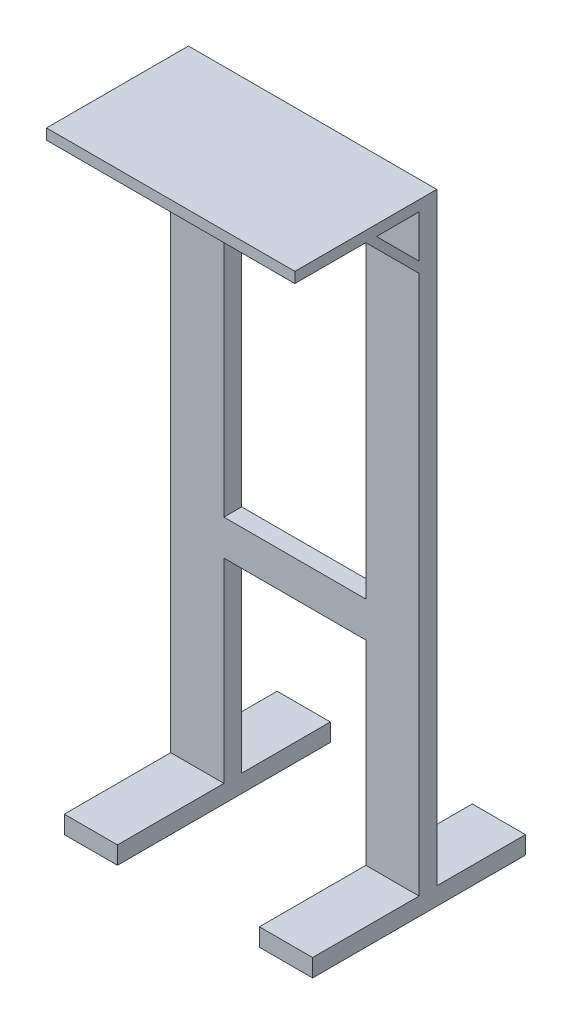
ISO-10303-21;
HEADER;
FILE_DESCRIPTION(('STEP AP214'),'2;1');
FILE_NAME('part.step','',(''),(''),'','','');
FILE_SCHEMA(('AUTOMOTIVE_DESIGN { 1 0 10303 214 1 1 1 1 }'));
ENDSEC;
DATA;
#1=APPLICATION_CONTEXT('core data for automotive mechanical design processes');
#2=APPLICATION_PROTOCOL_DEFINITION('international standard','automotive_design',2000,#1);
#3=PRODUCT_CONTEXT('',#1,'mechanical');
#4=PRODUCT('Part','Part','',(#3));
#5=PRODUCT_RELATED_PRODUCT_CATEGORY('part','',(#4));
#6=PRODUCT_DEFINITION_FORMATION('','',#4);
#7=PRODUCT_DEFINITION_CONTEXT('part definition',#1,'design');
#8=PRODUCT_DEFINITION('design','',#6,#7);
#9=PRODUCT_DEFINITION_SHAPE('','',#8);
#10=(LENGTH_UNIT() NAMED_UNIT(*) SI_UNIT(.MILLI.,.METRE.));
#11=(NAMED_UNIT(*) PLANE_ANGLE_UNIT() SI_UNIT($,.RADIAN.));
#12=(NAMED_UNIT(*) SI_UNIT($,.STERADIAN.) SOLID_ANGLE_UNIT());
#13=UNCERTAINTY_MEASURE_WITH_UNIT(LENGTH_MEASURE(1.E-05),#10,'distance_accuracy_value','');
#14=(GEOMETRIC_REPRESENTATION_CONTEXT(3) GLOBAL_UNCERTAINTY_ASSIGNED_CONTEXT((#13)) GLOBAL_UNIT_ASSIGNED_CONTEXT((#10,
#11,#12)) REPRESENTATION_CONTEXT('',''));
#15=CARTESIAN_POINT('',(0.,0.,0.));
#16=DIRECTION('',(0.,0.,1.));
#17=DIRECTION('',(1.,0.,0.));
#18=AXIS2_PLACEMENT_3D('',#15,#16,#17);
#19=CARTESIAN_POINT('',(0.,1750.,0.));
#20=DIRECTION('',(0.,0.,-1.));
#21=DIRECTION('',(-1.,0.,0.));
#22=AXIS2_PLACEMENT_3D('',#19,#20,#21);
#23=PLANE('',#22);
#24=DIRECTION('',(0.,1.,0.));
#25=VECTOR('',#24,1.);
#26=CARTESIAN_POINT('',(700.,600.,0.));
#27=LINE('',#26,#25);
#28=CARTESIAN_POINT('',(700.,50.,0.));
#29=VERTEX_POINT('',#28);
#30=CARTESIAN_POINT('',(700.,1570.,0.));
#31=VERTEX_POINT('',#30);
#32=EDGE_CURVE('E435',#29,#31,#27,.T.);
#33=ORIENTED_EDGE('',*,*,#32,.T.);
#34=DIRECTION('',(1.,0.,0.));
#35=VECTOR('',#34,1.);
#36=CARTESIAN_POINT('',(685.,1570.,0.));
#37=LINE('',#36,#35);
#38=CARTESIAN_POINT('',(685.,1570.,0.));
#39=VERTEX_POINT('',#38);
#40=EDGE_CURVE('E61',#39,#31,#37,.T.);
#41=ORIENTED_EDGE('',*,*,#40,.F.);
#42=DIRECTION('',(0.,1.,0.));
#43=VECTOR('',#42,1.);
#44=CARTESIAN_POINT('',(685.,1570.,0.));
#45=LINE('',#44,#43);
#46=CARTESIAN_POINT('',(685.,1600.,0.));
#47=VERTEX_POINT('',#46);
#48=EDGE_CURVE('E65',#39,#47,#45,.T.);
#49=ORIENTED_EDGE('',*,*,#48,.T.);
#50=DIRECTION('',(1.,0.,0.));
#51=VECTOR('',#50,1.);
#52=CARTESIAN_POINT('',(685.,1600.,0.));
#53=LINE('',#52,#51);
#54=CARTESIAN_POINT('',(700.,1600.,0.));
#55=VERTEX_POINT('',#54);
#56=EDGE_CURVE('E249',#47,#55,#53,.T.);
#57=ORIENTED_EDGE('',*,*,#56,.T.);
#58=CARTESIAN_POINT('',(700.,1720.,0.));
#59=VERTEX_POINT('',#58);
#60=EDGE_CURVE('E421',#55,#59,#27,.T.);
#61=ORIENTED_EDGE('',*,*,#60,.T.);
#62=DIRECTION('',(1.,0.,0.));
#63=VECTOR('',#62,1.);
#64=CARTESIAN_POINT('',(0.,1720.,0.));
#65=LINE('',#64,#63);
#66=CARTESIAN_POINT('',(0.,1720.,0.));
#67=VERTEX_POINT('',#66);
#68=EDGE_CURVE('E305',#67,#59,#65,.T.);
#69=ORIENTED_EDGE('',*,*,#68,.F.);
#70=DIRECTION('',(0.,-1.,0.));
#71=VECTOR('',#70,1.);
#72=CARTESIAN_POINT('',(0.,1750.,0.));
#73=LINE('',#72,#71);
#74=CARTESIAN_POINT('',(0.,1600.,0.));
#75=VERTEX_POINT('',#74);
#76=EDGE_CURVE('E467',#67,#75,#73,.T.);
#77=ORIENTED_EDGE('',*,*,#76,.T.);
#78=DIRECTION('',(-1.,0.,0.));
#79=VECTOR('',#78,1.);
#80=CARTESIAN_POINT('',(15.,1600.,0.));
#81=LINE('',#80,#79);
#82=CARTESIAN_POINT('',(15.,1600.,0.));
#83=VERTEX_POINT('',#82);
#84=EDGE_CURVE('E301',#83,#75,#81,.T.);
#85=ORIENTED_EDGE('',*,*,#84,.F.);
#86=DIRECTION('',(0.,-1.,0.));
#87=VECTOR('',#86,1.);
#88=CARTESIAN_POINT('',(15.,1570.,0.));
#89=LINE('',#88,#87);
#90=CARTESIAN_POINT('',(15.,1570.,0.));
#91=VERTEX_POINT('',#90);
#92=EDGE_CURVE('E279',#83,#91,#89,.T.);
#93=ORIENTED_EDGE('',*,*,#92,.T.);
#94=DIRECTION('',(-1.,0.,0.));
#95=VECTOR('',#94,1.);
#96=CARTESIAN_POINT('',(15.,1570.,0.));
#97=LINE('',#96,#95);
#98=CARTESIAN_POINT('',(0.,1570.,0.));
#99=VERTEX_POINT('',#98);
#100=EDGE_CURVE('E294',#91,#99,#97,.T.);
#101=ORIENTED_EDGE('',*,*,#100,.T.);
#102=CARTESIAN_POINT('',(0.,50.,0.));
#103=VERTEX_POINT('',#102);
#104=EDGE_CURVE('E460',#99,#103,#73,.T.);
#105=ORIENTED_EDGE('',*,*,#104,.T.);
#106=DIRECTION('',(1.,0.,0.));
#107=VECTOR('',#106,1.);
#108=CARTESIAN_POINT('',(0.,50.,0.));
#109=LINE('',#108,#107);
#110=CARTESIAN_POINT('',(150.,50.,0.));
#111=VERTEX_POINT('',#110);
#112=EDGE_CURVE('E452',#103,#111,#109,.T.);
#113=ORIENTED_EDGE('',*,*,#112,.T.);
#114=DIRECTION('',(0.,-1.,0.));
#115=VECTOR('',#114,1.);
#116=CARTESIAN_POINT('',(150.,1750.,0.));
#117=LINE('',#116,#115);
#118=CARTESIAN_POINT('',(150.,600.,0.));
#119=VERTEX_POINT('',#118);
#120=EDGE_CURVE('E477',#119,#111,#117,.T.);
#121=ORIENTED_EDGE('',*,*,#120,.F.);
#122=DIRECTION('',(1.,0.,0.));
#123=VECTOR('',#122,1.);
#124=CARTESIAN_POINT('',(700.,600.,0.));
#125=LINE('',#124,#123);
#126=CARTESIAN_POINT('',(550.,600.,0.));
#127=VERTEX_POINT('',#126);
#128=EDGE_CURVE('E427',#119,#127,#125,.T.);
#129=ORIENTED_EDGE('',*,*,#128,.T.);
#130=DIRECTION('',(0.,-1.,0.));
#131=VECTOR('',#130,1.);
#132=CARTESIAN_POINT('',(550.,1750.,0.));
#133=LINE('',#132,#131);
#134=CARTESIAN_POINT('',(550.,50.,0.));
#135=VERTEX_POINT('',#134);
#136=EDGE_CURVE('E357',#127,#135,#133,.T.);
#137=ORIENTED_EDGE('',*,*,#136,.T.);
#138=DIRECTION('',(-1.,0.,0.));
#139=VECTOR('',#138,1.);
#140=CARTESIAN_POINT('',(700.,50.,0.));
#141=LINE('',#140,#139);
#142=EDGE_CURVE('E365',#29,#135,#141,.T.);
#143=ORIENTED_EDGE('',*,*,#142,.F.);
#144=EDGE_LOOP('',(#33,#41,#49,#57,#61,#69,#77,#85,#93,#101,#105,#113,#121,#129,#137,#143));
#145=FACE_BOUND('',#144,.T.);
#146=CARTESIAN_POINT('',(150.,1650.,0.));
#147=VERTEX_POINT('',#146);
#148=CARTESIAN_POINT('',(150.,700.,0.));
#149=VERTEX_POINT('',#148);
#150=EDGE_CURVE('E478',#147,#149,#117,.T.);
#151=ORIENTED_EDGE('',*,*,#150,.F.);
#152=DIRECTION('',(1.,0.,0.));
#153=VECTOR('',#152,1.);
#154=CARTESIAN_POINT('',(0.,1650.,0.));
#155=LINE('',#154,#153);
#156=CARTESIAN_POINT('',(550.,1650.,0.));
#157=VERTEX_POINT('',#156);
#158=EDGE_CURVE('E343',#147,#157,#155,.T.);
#159=ORIENTED_EDGE('',*,*,#158,.T.);
#160=CARTESIAN_POINT('',(550.,700.,0.));
#161=VERTEX_POINT('',#160);
#162=EDGE_CURVE('E353',#157,#161,#133,.T.);
#163=ORIENTED_EDGE('',*,*,#162,.T.);
#164=DIRECTION('',(-1.,0.,0.));
#165=VECTOR('',#164,1.);
#166=CARTESIAN_POINT('',(700.,700.,0.));
#167=LINE('',#166,#165);
#168=EDGE_CURVE('E438',#161,#149,#167,.T.);
#169=ORIENTED_EDGE('',*,*,#168,.T.);
#170=EDGE_LOOP('',(#151,#159,#163,#169));
#171=FACE_BOUND('',#170,.T.);
#172=ADVANCED_FACE('F45',(#145,#171),#23,.F.);
#173=CARTESIAN_POINT('',(150.,50.,-300.));
#174=DIRECTION('',(-1.,0.,0.));
#175=DIRECTION('',(0.,0.,1.));
#176=AXIS2_PLACEMENT_3D('',#173,#174,#175);
#177=PLANE('',#176);
#178=DIRECTION('',(0.,-1.,0.));
#179=VECTOR('',#178,1.);
#180=CARTESIAN_POINT('',(150.,1750.,-50.));
#181=LINE('',#180,#179);
#182=CARTESIAN_POINT('',(150.,600.,-50.));
#183=VERTEX_POINT('',#182);
#184=CARTESIAN_POINT('',(150.,50.,-50.));
#185=VERTEX_POINT('',#184);
#186=EDGE_CURVE('E473',#183,#185,#181,.T.);
#187=ORIENTED_EDGE('',*,*,#186,.F.);
#188=DIRECTION('',(0.,0.,1.));
#189=VECTOR('',#188,1.);
#190=CARTESIAN_POINT('',(150.,600.,-300.));
#191=LINE('',#190,#189);
#192=EDGE_CURVE('E448',#183,#119,#191,.T.);
#193=ORIENTED_EDGE('',*,*,#192,.T.);
#194=ORIENTED_EDGE('',*,*,#120,.T.);
#195=DIRECTION('',(0.,0.,1.));
#196=VECTOR('',#195,1.);
#197=CARTESIAN_POINT('',(150.,50.,-300.));
#198=LINE('',#197,#196);
#199=CARTESIAN_POINT('',(150.,50.,300.));
#200=VERTEX_POINT('',#199);
#201=EDGE_CURVE('E524',#111,#200,#198,.T.);
#202=ORIENTED_EDGE('',*,*,#201,.T.);
#203=DIRECTION('',(0.,-1.,0.));
#204=VECTOR('',#203,1.);
#205=CARTESIAN_POINT('',(150.,50.,300.));
#206=LINE('',#205,#204);
#207=CARTESIAN_POINT('',(150.,0.,300.));
#208=VERTEX_POINT('',#207);
#209=EDGE_CURVE('E485',#200,#208,#206,.T.);
#210=ORIENTED_EDGE('',*,*,#209,.T.);
#211=DIRECTION('',(0.,0.,1.));
#212=VECTOR('',#211,1.);
#213=CARTESIAN_POINT('',(150.,0.,-300.));
#214=LINE('',#213,#212);
#215=CARTESIAN_POINT('',(150.,0.,-300.));
#216=VERTEX_POINT('',#215);
#217=EDGE_CURVE('E511',#216,#208,#214,.T.);
#218=ORIENTED_EDGE('',*,*,#217,.F.);
#219=DIRECTION('',(0.,-1.,0.));
#220=VECTOR('',#219,1.);
#221=CARTESIAN_POINT('',(150.,50.,-300.));
#222=LINE('',#221,#220);
#223=CARTESIAN_POINT('',(150.,50.,-300.));
#224=VERTEX_POINT('',#223);
#225=EDGE_CURVE('E501',#224,#216,#222,.T.);
#226=ORIENTED_EDGE('',*,*,#225,.F.);
#227=EDGE_CURVE('E520',#224,#185,#198,.T.);
#228=ORIENTED_EDGE('',*,*,#227,.T.);
#229=EDGE_LOOP('',(#187,#193,#194,#202,#210,#218,#226,#228));
#230=FACE_BOUND('',#229,.T.);
#231=ADVANCED_FACE('F553',(#230),#177,.F.);
#232=CARTESIAN_POINT('',(0.,50.,-300.));
#233=DIRECTION('',(0.,-1.,0.));
#234=DIRECTION('',(0.,0.,-1.));
#235=AXIS2_PLACEMENT_3D('',#232,#233,#234);
#236=PLANE('',#235);
#237=ORIENTED_EDGE('',*,*,#112,.F.);
#238=DIRECTION('',(0.,0.,1.));
#239=VECTOR('',#238,1.);
#240=CARTESIAN_POINT('',(0.,50.,-300.));
#241=LINE('',#240,#239);
#242=CARTESIAN_POINT('',(0.,50.,300.));
#243=VERTEX_POINT('',#242);
#244=EDGE_CURVE('E519',#103,#243,#241,.T.);
#245=ORIENTED_EDGE('',*,*,#244,.T.);
#246=DIRECTION('',(1.,0.,0.));
#247=VECTOR('',#246,1.);
#248=CARTESIAN_POINT('',(0.,50.,300.));
#249=LINE('',#248,#247);
#250=EDGE_CURVE('E489',#243,#200,#249,.T.);
#251=ORIENTED_EDGE('',*,*,#250,.T.);
#252=ORIENTED_EDGE('',*,*,#201,.F.);
#253=EDGE_LOOP('',(#237,#245,#251,#252));
#254=FACE_BOUND('',#253,.T.);
#255=ADVANCED_FACE('F566',(#254),#236,.F.);
#256=CARTESIAN_POINT('',(0.,0.,-300.));
#257=DIRECTION('',(0.,-1.,0.));
#258=DIRECTION('',(0.,0.,-1.));
#259=AXIS2_PLACEMENT_3D('',#256,#257,#258);
#260=PLANE('',#259);
#261=ORIENTED_EDGE('',*,*,#217,.T.);
#262=DIRECTION('',(1.,0.,0.));
#263=VECTOR('',#262,1.);
#264=CARTESIAN_POINT('',(0.,0.,300.));
#265=LINE('',#264,#263);
#266=CARTESIAN_POINT('',(0.,0.,300.));
#267=VERTEX_POINT('',#266);
#268=EDGE_CURVE('E481',#267,#208,#265,.T.);
#269=ORIENTED_EDGE('',*,*,#268,.F.);
#270=DIRECTION('',(0.,0.,1.));
#271=VECTOR('',#270,1.);
#272=CARTESIAN_POINT('',(0.,0.,-300.));
#273=LINE('',#272,#271);
#274=CARTESIAN_POINT('',(0.,0.,-300.));
#275=VERTEX_POINT('',#274);
#276=EDGE_CURVE('E512',#275,#267,#273,.T.);
#277=ORIENTED_EDGE('',*,*,#276,.F.);
#278=DIRECTION('',(1.,0.,0.));
#279=VECTOR('',#278,1.);
#280=CARTESIAN_POINT('',(0.,0.,-300.));
#281=LINE('',#280,#279);
#282=EDGE_CURVE('E497',#275,#216,#281,.T.);
#283=ORIENTED_EDGE('',*,*,#282,.T.);
#284=EDGE_LOOP('',(#261,#269,#277,#283));
#285=FACE_BOUND('',#284,.T.);
#286=ADVANCED_FACE('F47',(#285),#260,.T.);
#287=CARTESIAN_POINT('',(0.,50.,-300.));
#288=DIRECTION('',(-1.,0.,0.));
#289=DIRECTION('',(0.,0.,1.));
#290=AXIS2_PLACEMENT_3D('',#287,#288,#289);
#291=PLANE('',#290);
#292=ORIENTED_EDGE('',*,*,#104,.F.);
#293=DIRECTION('',(0.,0.707106781186547,0.707106781186548));
#294=VECTOR('',#293,1.);
#295=CARTESIAN_POINT('',(0.,1570.,0.));
#296=LINE('',#295,#294);
#297=CARTESIAN_POINT('',(0.,1720.,150.));
#298=VERTEX_POINT('',#297);
#299=EDGE_CURVE('E272',#99,#298,#296,.T.);
#300=ORIENTED_EDGE('',*,*,#299,.T.);
#301=DIRECTION('',(0.,0.,-1.));
#302=VECTOR('',#301,1.);
#303=CARTESIAN_POINT('',(0.,1720.,350.));
#304=LINE('',#303,#302);
#305=CARTESIAN_POINT('',(0.,1720.,350.));
#306=VERTEX_POINT('',#305);
#307=EDGE_CURVE('E339',#306,#298,#304,.T.);
#308=ORIENTED_EDGE('',*,*,#307,.F.);
#309=DIRECTION('',(0.,-1.,0.));
#310=VECTOR('',#309,1.);
#311=CARTESIAN_POINT('',(0.,1750.,350.));
#312=LINE('',#311,#310);
#313=CARTESIAN_POINT('',(0.,1750.,350.));
#314=VERTEX_POINT('',#313);
#315=EDGE_CURVE('E317',#314,#306,#312,.T.);
#316=ORIENTED_EDGE('',*,*,#315,.F.);
#317=DIRECTION('',(0.,0.,1.));
#318=VECTOR('',#317,1.);
#319=CARTESIAN_POINT('',(0.,1750.,-50.));
#320=LINE('',#319,#318);
#321=CARTESIAN_POINT('',(0.,1750.,-50.));
#322=VERTEX_POINT('',#321);
#323=EDGE_CURVE('E456',#322,#314,#320,.T.);
#324=ORIENTED_EDGE('',*,*,#323,.F.);
#325=DIRECTION('',(0.,-1.,0.));
#326=VECTOR('',#325,1.);
#327=CARTESIAN_POINT('',(0.,1750.,-50.));
#328=LINE('',#327,#326);
#329=CARTESIAN_POINT('',(0.,50.,-50.));
#330=VERTEX_POINT('',#329);
#331=EDGE_CURVE('E470',#322,#330,#328,.T.);
#332=ORIENTED_EDGE('',*,*,#331,.T.);
#333=CARTESIAN_POINT('',(0.,50.,-300.));
#334=VERTEX_POINT('',#333);
#335=EDGE_CURVE('E515',#334,#330,#241,.T.);
#336=ORIENTED_EDGE('',*,*,#335,.F.);
#337=DIRECTION('',(0.,-1.,0.));
#338=VECTOR('',#337,1.);
#339=CARTESIAN_POINT('',(0.,50.,-300.));
#340=LINE('',#339,#338);
#341=EDGE_CURVE('E507',#334,#275,#340,.T.);
#342=ORIENTED_EDGE('',*,*,#341,.T.);
#343=ORIENTED_EDGE('',*,*,#276,.T.);
#344=DIRECTION('',(0.,-1.,0.));
#345=VECTOR('',#344,1.);
#346=CARTESIAN_POINT('',(0.,50.,300.));
#347=LINE('',#346,#345);
#348=EDGE_CURVE('E493',#243,#267,#347,.T.);
#349=ORIENTED_EDGE('',*,*,#348,.F.);
#350=ORIENTED_EDGE('',*,*,#244,.F.);
#351=EDGE_LOOP('',(#292,#300,#308,#316,#324,#332,#336,#342,#343,#349,#350));
#352=FACE_BOUND('',#351,.T.);
#353=DIRECTION('',(0.,-0.707106781186547,-0.707106781186548));
#354=VECTOR('',#353,1.);
#355=CARTESIAN_POINT('',(0.,1600.,0.));
#356=LINE('',#355,#354);
#357=CARTESIAN_POINT('',(0.,1720.,120.));
#358=VERTEX_POINT('',#357);
#359=EDGE_CURVE('E283',#358,#75,#356,.T.);
#360=ORIENTED_EDGE('',*,*,#359,.T.);
#361=ORIENTED_EDGE('',*,*,#76,.F.);
#362=EDGE_CURVE('E338',#358,#67,#304,.T.);
#363=ORIENTED_EDGE('',*,*,#362,.F.);
#364=EDGE_LOOP('',(#360,#361,#363));
#365=FACE_BOUND('',#364,.T.);
#366=ADVANCED_FACE('F563',(#352,#365),#291,.T.);
#367=ORIENTED_EDGE('',*,*,#335,.T.);
#368=DIRECTION('',(1.,0.,0.));
#369=VECTOR('',#368,1.);
#370=CARTESIAN_POINT('',(0.,50.,-50.));
#371=LINE('',#370,#369);
#372=EDGE_CURVE('E457',#330,#185,#371,.T.);
#373=ORIENTED_EDGE('',*,*,#372,.T.);
#374=ORIENTED_EDGE('',*,*,#227,.F.);
#375=DIRECTION('',(1.,0.,0.));
#376=VECTOR('',#375,1.);
#377=CARTESIAN_POINT('',(0.,50.,-300.));
#378=LINE('',#377,#376);
#379=EDGE_CURVE('E504',#334,#224,#378,.T.);
#380=ORIENTED_EDGE('',*,*,#379,.F.);
#381=EDGE_LOOP('',(#367,#373,#374,#380));
#382=FACE_BOUND('',#381,.T.);
#383=ADVANCED_FACE('F552',(#382),#236,.F.);
#384=CARTESIAN_POINT('',(150.,1650.,-50.));
#385=VERTEX_POINT('',#384);
#386=CARTESIAN_POINT('',(150.,700.,-50.));
#387=VERTEX_POINT('',#386);
#388=EDGE_CURVE('E474',#385,#387,#181,.T.);
#389=ORIENTED_EDGE('',*,*,#388,.F.);
#390=DIRECTION('',(0.,0.,1.));
#391=VECTOR('',#390,1.);
#392=CARTESIAN_POINT('',(150.,1650.,-300.));
#393=LINE('',#392,#391);
#394=EDGE_CURVE('E346',#385,#147,#393,.T.);
#395=ORIENTED_EDGE('',*,*,#394,.T.);
#396=ORIENTED_EDGE('',*,*,#150,.T.);
#397=DIRECTION('',(0.,0.,-1.));
#398=VECTOR('',#397,1.);
#399=CARTESIAN_POINT('',(150.,700.,-300.));
#400=LINE('',#399,#398);
#401=EDGE_CURVE('E434',#149,#387,#400,.T.);
#402=ORIENTED_EDGE('',*,*,#401,.T.);
#403=EDGE_LOOP('',(#389,#395,#396,#402));
#404=FACE_BOUND('',#403,.T.);
#405=ADVANCED_FACE('F549',(#404),#177,.F.);
#406=CARTESIAN_POINT('',(0.,0.,-300.));
#407=DIRECTION('',(0.,0.,-1.));
#408=DIRECTION('',(-1.,0.,0.));
#409=AXIS2_PLACEMENT_3D('',#406,#407,#408);
#410=PLANE('',#409);
#411=ORIENTED_EDGE('',*,*,#282,.F.);
#412=ORIENTED_EDGE('',*,*,#341,.F.);
#413=ORIENTED_EDGE('',*,*,#379,.T.);
#414=ORIENTED_EDGE('',*,*,#225,.T.);
#415=EDGE_LOOP('',(#411,#412,#413,#414));
#416=FACE_BOUND('',#415,.T.);
#417=ADVANCED_FACE('F551',(#416),#410,.T.);
#418=CARTESIAN_POINT('',(0.,0.,300.));
#419=DIRECTION('',(0.,0.,-1.));
#420=DIRECTION('',(-1.,0.,0.));
#421=AXIS2_PLACEMENT_3D('',#418,#419,#420);
#422=PLANE('',#421);
#423=ORIENTED_EDGE('',*,*,#268,.T.);
#424=ORIENTED_EDGE('',*,*,#209,.F.);
#425=ORIENTED_EDGE('',*,*,#250,.F.);
#426=ORIENTED_EDGE('',*,*,#348,.T.);
#427=EDGE_LOOP('',(#423,#424,#425,#426));
#428=FACE_BOUND('',#427,.T.);
#429=ADVANCED_FACE('F559',(#428),#422,.F.);
#430=CARTESIAN_POINT('',(0.,1750.,-50.));
#431=DIRECTION('',(0.,0.,-1.));
#432=DIRECTION('',(-1.,0.,0.));
#433=AXIS2_PLACEMENT_3D('',#430,#431,#432);
#434=PLANE('',#433);
#435=DIRECTION('',(1.,0.,0.));
#436=VECTOR('',#435,1.);
#437=CARTESIAN_POINT('',(0.,1650.,-49.9999999999998));
#438=LINE('',#437,#436);
#439=CARTESIAN_POINT('',(550.,1650.,-49.9999999999998));
#440=VERTEX_POINT('',#439);
#441=EDGE_CURVE('E342',#385,#440,#438,.T.);
#442=ORIENTED_EDGE('',*,*,#441,.F.);
#443=ORIENTED_EDGE('',*,*,#388,.T.);
#444=DIRECTION('',(-1.,0.,0.));
#445=VECTOR('',#444,1.);
#446=CARTESIAN_POINT('',(700.,700.,-49.9999999999998));
#447=LINE('',#446,#445);
#448=CARTESIAN_POINT('',(550.,700.,-50.));
#449=VERTEX_POINT('',#448);
#450=EDGE_CURVE('E426',#449,#387,#447,.T.);
#451=ORIENTED_EDGE('',*,*,#450,.F.);
#452=DIRECTION('',(0.,-1.,0.));
#453=VECTOR('',#452,1.);
#454=CARTESIAN_POINT('',(550.,1750.,-50.));
#455=LINE('',#454,#453);
#456=EDGE_CURVE('E358',#440,#449,#455,.T.);
#457=ORIENTED_EDGE('',*,*,#456,.F.);
#458=EDGE_LOOP('',(#442,#443,#451,#457));
#459=FACE_BOUND('',#458,.T.);
#460=DIRECTION('',(1.,0.,0.));
#461=VECTOR('',#460,1.);
#462=CARTESIAN_POINT('',(0.,1750.,-50.));
#463=LINE('',#462,#461);
#464=CARTESIAN_POINT('',(700.,1750.,-50.));
#465=VERTEX_POINT('',#464);
#466=EDGE_CURVE('E453',#322,#465,#463,.T.);
#467=ORIENTED_EDGE('',*,*,#466,.T.);
#468=DIRECTION('',(0.,1.,0.));
#469=VECTOR('',#468,1.);
#470=CARTESIAN_POINT('',(700.,600.,-49.9999999999998));
#471=LINE('',#470,#469);
#472=CARTESIAN_POINT('',(700.,50.,-50.));
#473=VERTEX_POINT('',#472);
#474=EDGE_CURVE('E422',#473,#465,#471,.T.);
#475=ORIENTED_EDGE('',*,*,#474,.F.);
#476=DIRECTION('',(-1.,0.,0.));
#477=VECTOR('',#476,1.);
#478=CARTESIAN_POINT('',(700.,50.,-50.));
#479=LINE('',#478,#477);
#480=CARTESIAN_POINT('',(550.,50.,-50.));
#481=VERTEX_POINT('',#480);
#482=EDGE_CURVE('E361',#473,#481,#479,.T.);
#483=ORIENTED_EDGE('',*,*,#482,.T.);
#484=CARTESIAN_POINT('',(550.,600.,-49.9999999999998));
#485=VERTEX_POINT('',#484);
#486=EDGE_CURVE('E352',#485,#481,#455,.T.);
#487=ORIENTED_EDGE('',*,*,#486,.F.);
#488=DIRECTION('',(1.,0.,0.));
#489=VECTOR('',#488,1.);
#490=CARTESIAN_POINT('',(700.,600.,-49.9999999999998));
#491=LINE('',#490,#489);
#492=EDGE_CURVE('E431',#183,#485,#491,.T.);
#493=ORIENTED_EDGE('',*,*,#492,.F.);
#494=ORIENTED_EDGE('',*,*,#186,.T.);
#495=ORIENTED_EDGE('',*,*,#372,.F.);
#496=ORIENTED_EDGE('',*,*,#331,.F.);
#497=EDGE_LOOP('',(#467,#475,#483,#487,#493,#494,#495,#496));
#498=FACE_BOUND('',#497,.T.);
#499=ADVANCED_FACE('F546',(#459,#498),#434,.T.);
#500=CARTESIAN_POINT('',(0.,1750.,0.));
#501=DIRECTION('',(0.,-1.,0.));
#502=DIRECTION('',(0.,0.,-1.));
#503=AXIS2_PLACEMENT_3D('',#500,#501,#502);
#504=PLANE('',#503);
#505=ORIENTED_EDGE('',*,*,#323,.T.);
#506=DIRECTION('',(-1.,0.,0.));
#507=VECTOR('',#506,1.);
#508=CARTESIAN_POINT('',(0.,1750.,350.));
#509=LINE('',#508,#507);
#510=CARTESIAN_POINT('',(700.,1750.,350.));
#511=VERTEX_POINT('',#510);
#512=EDGE_CURVE('E328',#511,#314,#509,.T.);
#513=ORIENTED_EDGE('',*,*,#512,.F.);
#514=DIRECTION('',(0.,0.,1.));
#515=VECTOR('',#514,1.);
#516=CARTESIAN_POINT('',(700.,1750.,-50.));
#517=LINE('',#516,#515);
#518=EDGE_CURVE('E356',#465,#511,#517,.T.);
#519=ORIENTED_EDGE('',*,*,#518,.F.);
#520=ORIENTED_EDGE('',*,*,#466,.F.);
#521=EDGE_LOOP('',(#505,#513,#519,#520));
#522=FACE_BOUND('',#521,.T.);
#523=ADVANCED_FACE('F647',(#522),#504,.F.);
#524=CARTESIAN_POINT('',(700.,600.,-49.9999999999998));
#525=DIRECTION('',(0.,-1.,0.));
#526=DIRECTION('',(0.,0.,-1.));
#527=AXIS2_PLACEMENT_3D('',#524,#525,#526);
#528=PLANE('',#527);
#529=DIRECTION('',(0.,0.,-1.));
#530=VECTOR('',#529,1.);
#531=CARTESIAN_POINT('',(550.,600.,-49.9999999999998));
#532=LINE('',#531,#530);
#533=EDGE_CURVE('E417',#127,#485,#532,.T.);
#534=ORIENTED_EDGE('',*,*,#533,.F.);
#535=ORIENTED_EDGE('',*,*,#128,.F.);
#536=ORIENTED_EDGE('',*,*,#192,.F.);
#537=ORIENTED_EDGE('',*,*,#492,.T.);
#538=EDGE_LOOP('',(#534,#535,#536,#537));
#539=FACE_BOUND('',#538,.T.);
#540=ADVANCED_FACE('F691',(#539),#528,.T.);
#541=CARTESIAN_POINT('',(700.,700.,-49.9999999999998));
#542=DIRECTION('',(0.,1.,0.));
#543=DIRECTION('',(-1.,0.,0.));
#544=AXIS2_PLACEMENT_3D('',#541,#542,#543);
#545=PLANE('',#544);
#546=DIRECTION('',(0.,0.,1.));
#547=VECTOR('',#546,1.);
#548=CARTESIAN_POINT('',(550.,700.,-49.9999999999998));
#549=LINE('',#548,#547);
#550=EDGE_CURVE('E54',#449,#161,#549,.T.);
#551=ORIENTED_EDGE('',*,*,#550,.F.);
#552=ORIENTED_EDGE('',*,*,#450,.T.);
#553=ORIENTED_EDGE('',*,*,#401,.F.);
#554=ORIENTED_EDGE('',*,*,#168,.F.);
#555=EDGE_LOOP('',(#551,#552,#553,#554));
#556=FACE_BOUND('',#555,.T.);
#557=ADVANCED_FACE('F537',(#556),#545,.T.);
#558=CARTESIAN_POINT('',(700.,600.,-49.9999999999998));
#559=DIRECTION('',(1.,0.,0.));
#560=DIRECTION('',(0.,0.,-1.));
#561=AXIS2_PLACEMENT_3D('',#558,#559,#560);
#562=PLANE('',#561);
#563=ORIENTED_EDGE('',*,*,#60,.F.);
#564=DIRECTION('',(0.,0.707106781186547,0.707106781186548));
#565=VECTOR('',#564,1.);
#566=CARTESIAN_POINT('',(700.,1600.,0.));
#567=LINE('',#566,#565);
#568=CARTESIAN_POINT('',(700.,1720.,120.));
#569=VERTEX_POINT('',#568);
#570=EDGE_CURVE('E626',#55,#569,#567,.T.);
#571=ORIENTED_EDGE('',*,*,#570,.T.);
#572=DIRECTION('',(0.,0.,-1.));
#573=VECTOR('',#572,1.);
#574=CARTESIAN_POINT('',(700.,1720.,350.));
#575=LINE('',#574,#573);
#576=EDGE_CURVE('E266',#569,#59,#575,.T.);
#577=ORIENTED_EDGE('',*,*,#576,.T.);
#578=EDGE_LOOP('',(#563,#571,#577));
#579=FACE_BOUND('',#578,.T.);
#580=ORIENTED_EDGE('',*,*,#474,.T.);
#581=ORIENTED_EDGE('',*,*,#518,.T.);
#582=DIRECTION('',(0.,1.,0.));
#583=VECTOR('',#582,1.);
#584=CARTESIAN_POINT('',(700.,1750.,350.));
#585=LINE('',#584,#583);
#586=CARTESIAN_POINT('',(700.,1720.,350.));
#587=VERTEX_POINT('',#586);
#588=EDGE_CURVE('E324',#587,#511,#585,.T.);
#589=ORIENTED_EDGE('',*,*,#588,.F.);
#590=CARTESIAN_POINT('',(700.,1720.,150.));
#591=VERTEX_POINT('',#590);
#592=EDGE_CURVE('E334',#587,#591,#575,.T.);
#593=ORIENTED_EDGE('',*,*,#592,.T.);
#594=DIRECTION('',(0.,-0.707106781186547,-0.707106781186548));
#595=VECTOR('',#594,1.);
#596=CARTESIAN_POINT('',(700.,1720.,150.));
#597=LINE('',#596,#595);
#598=EDGE_CURVE('E628',#591,#31,#597,.T.);
#599=ORIENTED_EDGE('',*,*,#598,.T.);
#600=ORIENTED_EDGE('',*,*,#32,.F.);
#601=DIRECTION('',(0.,0.,1.));
#602=VECTOR('',#601,1.);
#603=CARTESIAN_POINT('',(700.,50.,-300.));
#604=LINE('',#603,#602);
#605=CARTESIAN_POINT('',(700.,50.,300.));
#606=VERTEX_POINT('',#605);
#607=EDGE_CURVE('E379',#29,#606,#604,.T.);
#608=ORIENTED_EDGE('',*,*,#607,.T.);
#609=DIRECTION('',(0.,-1.,0.));
#610=VECTOR('',#609,1.);
#611=CARTESIAN_POINT('',(700.,50.,300.));
#612=LINE('',#611,#610);
#613=CARTESIAN_POINT('',(700.,0.,300.));
#614=VERTEX_POINT('',#613);
#615=EDGE_CURVE('E401',#606,#614,#612,.T.);
#616=ORIENTED_EDGE('',*,*,#615,.T.);
#617=DIRECTION('',(0.,0.,1.));
#618=VECTOR('',#617,1.);
#619=CARTESIAN_POINT('',(700.,0.,-300.));
#620=LINE('',#619,#618);
#621=CARTESIAN_POINT('',(700.,0.,-300.));
#622=VERTEX_POINT('',#621);
#623=EDGE_CURVE('E384',#622,#614,#620,.T.);
#624=ORIENTED_EDGE('',*,*,#623,.F.);
#625=DIRECTION('',(0.,-1.,0.));
#626=VECTOR('',#625,1.);
#627=CARTESIAN_POINT('',(700.,50.,-300.));
#628=LINE('',#627,#626);
#629=CARTESIAN_POINT('',(700.,50.,-300.));
#630=VERTEX_POINT('',#629);
#631=EDGE_CURVE('E387',#630,#622,#628,.T.);
#632=ORIENTED_EDGE('',*,*,#631,.F.);
#633=EDGE_CURVE('E380',#630,#473,#604,.T.);
#634=ORIENTED_EDGE('',*,*,#633,.T.);
#635=EDGE_LOOP('',(#580,#581,#589,#593,#599,#600,#608,#616,#624,#632,#634));
#636=FACE_BOUND('',#635,.T.);
#637=ADVANCED_FACE('F624',(#579,#636),#562,.T.);
#638=CARTESIAN_POINT('',(550.,50.,-300.));
#639=DIRECTION('',(-1.,0.,0.));
#640=DIRECTION('',(0.,0.,1.));
#641=AXIS2_PLACEMENT_3D('',#638,#639,#640);
#642=PLANE('',#641);
#643=DIRECTION('',(0.,0.,1.));
#644=VECTOR('',#643,1.);
#645=CARTESIAN_POINT('',(550.,1650.,-300.));
#646=LINE('',#645,#644);
#647=EDGE_CURVE('E11',#440,#157,#646,.T.);
#648=ORIENTED_EDGE('',*,*,#647,.F.);
#649=ORIENTED_EDGE('',*,*,#456,.T.);
#650=ORIENTED_EDGE('',*,*,#550,.T.);
#651=ORIENTED_EDGE('',*,*,#162,.F.);
#652=EDGE_LOOP('',(#648,#649,#650,#651));
#653=FACE_BOUND('',#652,.T.);
#654=ADVANCED_FACE('F532',(#653),#642,.T.);
#655=ORIENTED_EDGE('',*,*,#136,.F.);
#656=ORIENTED_EDGE('',*,*,#533,.T.);
#657=ORIENTED_EDGE('',*,*,#486,.T.);
#658=DIRECTION('',(0.,0.,1.));
#659=VECTOR('',#658,1.);
#660=CARTESIAN_POINT('',(550.,50.,-300.));
#661=LINE('',#660,#659);
#662=CARTESIAN_POINT('',(550.,50.,-300.));
#663=VERTEX_POINT('',#662);
#664=EDGE_CURVE('E375',#663,#481,#661,.T.);
#665=ORIENTED_EDGE('',*,*,#664,.F.);
#666=DIRECTION('',(0.,-1.,0.));
#667=VECTOR('',#666,1.);
#668=CARTESIAN_POINT('',(550.,50.,-300.));
#669=LINE('',#668,#667);
#670=CARTESIAN_POINT('',(550.,0.,-300.));
#671=VERTEX_POINT('',#670);
#672=EDGE_CURVE('E394',#663,#671,#669,.T.);
#673=ORIENTED_EDGE('',*,*,#672,.T.);
#674=DIRECTION('',(0.,0.,1.));
#675=VECTOR('',#674,1.);
#676=CARTESIAN_POINT('',(550.,0.,-300.));
#677=LINE('',#676,#675);
#678=CARTESIAN_POINT('',(550.,0.,300.));
#679=VERTEX_POINT('',#678);
#680=EDGE_CURVE('E369',#671,#679,#677,.T.);
#681=ORIENTED_EDGE('',*,*,#680,.T.);
#682=DIRECTION('',(0.,-1.,0.));
#683=VECTOR('',#682,1.);
#684=CARTESIAN_POINT('',(550.,50.,300.));
#685=LINE('',#684,#683);
#686=CARTESIAN_POINT('',(550.,50.,300.));
#687=VERTEX_POINT('',#686);
#688=EDGE_CURVE('E409',#687,#679,#685,.T.);
#689=ORIENTED_EDGE('',*,*,#688,.F.);
#690=EDGE_CURVE('E374',#135,#687,#661,.T.);
#691=ORIENTED_EDGE('',*,*,#690,.F.);
#692=EDGE_LOOP('',(#655,#656,#657,#665,#673,#681,#689,#691));
#693=FACE_BOUND('',#692,.T.);
#694=ADVANCED_FACE('F668',(#693),#642,.T.);
#695=CARTESIAN_POINT('',(700.,50.,-300.));
#696=DIRECTION('',(0.,1.,0.));
#697=DIRECTION('',(0.,0.,1.));
#698=AXIS2_PLACEMENT_3D('',#695,#696,#697);
#699=PLANE('',#698);
#700=ORIENTED_EDGE('',*,*,#607,.F.);
#701=ORIENTED_EDGE('',*,*,#142,.T.);
#702=ORIENTED_EDGE('',*,*,#690,.T.);
#703=DIRECTION('',(-1.,0.,0.));
#704=VECTOR('',#703,1.);
#705=CARTESIAN_POINT('',(700.,50.,300.));
#706=LINE('',#705,#704);
#707=EDGE_CURVE('E405',#606,#687,#706,.T.);
#708=ORIENTED_EDGE('',*,*,#707,.F.);
#709=EDGE_LOOP('',(#700,#701,#702,#708));
#710=FACE_BOUND('',#709,.T.);
#711=ADVANCED_FACE('F673',(#710),#699,.T.);
#712=CARTESIAN_POINT('',(700.,0.,-300.));
#713=DIRECTION('',(0.,1.,0.));
#714=DIRECTION('',(0.,0.,1.));
#715=AXIS2_PLACEMENT_3D('',#712,#713,#714);
#716=PLANE('',#715);
#717=ORIENTED_EDGE('',*,*,#623,.T.);
#718=DIRECTION('',(-1.,0.,0.));
#719=VECTOR('',#718,1.);
#720=CARTESIAN_POINT('',(700.,0.,300.));
#721=LINE('',#720,#719);
#722=EDGE_CURVE('E413',#614,#679,#721,.T.);
#723=ORIENTED_EDGE('',*,*,#722,.T.);
#724=ORIENTED_EDGE('',*,*,#680,.F.);
#725=DIRECTION('',(-1.,0.,0.));
#726=VECTOR('',#725,1.);
#727=CARTESIAN_POINT('',(700.,0.,-300.));
#728=LINE('',#727,#726);
#729=EDGE_CURVE('E398',#622,#671,#728,.T.);
#730=ORIENTED_EDGE('',*,*,#729,.F.);
#731=EDGE_LOOP('',(#717,#723,#724,#730));
#732=FACE_BOUND('',#731,.T.);
#733=ADVANCED_FACE('F684',(#732),#716,.F.);
#734=ORIENTED_EDGE('',*,*,#482,.F.);
#735=ORIENTED_EDGE('',*,*,#633,.F.);
#736=DIRECTION('',(-1.,0.,0.));
#737=VECTOR('',#736,1.);
#738=CARTESIAN_POINT('',(700.,50.,-300.));
#739=LINE('',#738,#737);
#740=EDGE_CURVE('E390',#630,#663,#739,.T.);
#741=ORIENTED_EDGE('',*,*,#740,.T.);
#742=ORIENTED_EDGE('',*,*,#664,.T.);
#743=EDGE_LOOP('',(#734,#735,#741,#742));
#744=FACE_BOUND('',#743,.T.);
#745=ADVANCED_FACE('F690',(#744),#699,.T.);
#746=CARTESIAN_POINT('',(0.,0.,-300.));
#747=DIRECTION('',(0.,0.,1.));
#748=DIRECTION('',(1.,0.,0.));
#749=AXIS2_PLACEMENT_3D('',#746,#747,#748);
#750=PLANE('',#749);
#751=ORIENTED_EDGE('',*,*,#729,.T.);
#752=ORIENTED_EDGE('',*,*,#672,.F.);
#753=ORIENTED_EDGE('',*,*,#740,.F.);
#754=ORIENTED_EDGE('',*,*,#631,.T.);
#755=EDGE_LOOP('',(#751,#752,#753,#754));
#756=FACE_BOUND('',#755,.T.);
#757=ADVANCED_FACE('F687',(#756),#750,.F.);
#758=CARTESIAN_POINT('',(0.,0.,300.));
#759=DIRECTION('',(0.,0.,1.));
#760=DIRECTION('',(1.,0.,0.));
#761=AXIS2_PLACEMENT_3D('',#758,#759,#760);
#762=PLANE('',#761);
#763=ORIENTED_EDGE('',*,*,#722,.F.);
#764=ORIENTED_EDGE('',*,*,#615,.F.);
#765=ORIENTED_EDGE('',*,*,#707,.T.);
#766=ORIENTED_EDGE('',*,*,#688,.T.);
#767=EDGE_LOOP('',(#763,#764,#765,#766));
#768=FACE_BOUND('',#767,.T.);
#769=ADVANCED_FACE('F677',(#768),#762,.T.);
#770=CARTESIAN_POINT('',(0.,1650.,-49.9999999999998));
#771=DIRECTION('',(0.,-1.,0.));
#772=DIRECTION('',(0.,0.,-1.));
#773=AXIS2_PLACEMENT_3D('',#770,#771,#772);
#774=PLANE('',#773);
#775=ORIENTED_EDGE('',*,*,#394,.F.);
#776=ORIENTED_EDGE('',*,*,#441,.T.);
#777=ORIENTED_EDGE('',*,*,#647,.T.);
#778=ORIENTED_EDGE('',*,*,#158,.F.);
#779=EDGE_LOOP('',(#775,#776,#777,#778));
#780=FACE_BOUND('',#779,.T.);
#781=ADVANCED_FACE('F543',(#780),#774,.T.);
#782=CARTESIAN_POINT('',(0.,1720.,350.));
#783=DIRECTION('',(0.,1.,0.));
#784=DIRECTION('',(0.,0.,1.));
#785=AXIS2_PLACEMENT_3D('',#782,#783,#784);
#786=PLANE('',#785);
#787=DIRECTION('',(0.,0.,1.));
#788=VECTOR('',#787,1.);
#789=CARTESIAN_POINT('',(685.,1720.,120.));
#790=LINE('',#789,#788);
#791=CARTESIAN_POINT('',(685.,1720.,120.));
#792=VERTEX_POINT('',#791);
#793=CARTESIAN_POINT('',(685.,1720.,150.));
#794=VERTEX_POINT('',#793);
#795=EDGE_CURVE('E252',#792,#794,#790,.T.);
#796=ORIENTED_EDGE('',*,*,#795,.T.);
#797=DIRECTION('',(1.,0.,0.));
#798=VECTOR('',#797,1.);
#799=CARTESIAN_POINT('',(685.,1720.,150.));
#800=LINE('',#799,#798);
#801=EDGE_CURVE('E268',#794,#591,#800,.T.);
#802=ORIENTED_EDGE('',*,*,#801,.T.);
#803=ORIENTED_EDGE('',*,*,#592,.F.);
#804=DIRECTION('',(1.,0.,0.));
#805=VECTOR('',#804,1.);
#806=CARTESIAN_POINT('',(0.,1720.,350.));
#807=LINE('',#806,#805);
#808=EDGE_CURVE('E321',#306,#587,#807,.T.);
#809=ORIENTED_EDGE('',*,*,#808,.F.);
#810=ORIENTED_EDGE('',*,*,#307,.T.);
#811=DIRECTION('',(-1.,0.,0.));
#812=VECTOR('',#811,1.);
#813=CARTESIAN_POINT('',(15.,1720.,150.));
#814=LINE('',#813,#812);
#815=CARTESIAN_POINT('',(15.,1720.,150.));
#816=VERTEX_POINT('',#815);
#817=EDGE_CURVE('E310',#816,#298,#814,.T.);
#818=ORIENTED_EDGE('',*,*,#817,.F.);
#819=DIRECTION('',(0.,0.,-1.));
#820=VECTOR('',#819,1.);
#821=CARTESIAN_POINT('',(15.,1720.,150.));
#822=LINE('',#821,#820);
#823=CARTESIAN_POINT('',(15.,1720.,120.));
#824=VERTEX_POINT('',#823);
#825=EDGE_CURVE('E287',#816,#824,#822,.T.);
#826=ORIENTED_EDGE('',*,*,#825,.T.);
#827=DIRECTION('',(-1.,0.,0.));
#828=VECTOR('',#827,1.);
#829=CARTESIAN_POINT('',(15.,1720.,120.));
#830=LINE('',#829,#828);
#831=EDGE_CURVE('E306',#824,#358,#830,.T.);
#832=ORIENTED_EDGE('',*,*,#831,.T.);
#833=ORIENTED_EDGE('',*,*,#362,.T.);
#834=ORIENTED_EDGE('',*,*,#68,.T.);
#835=ORIENTED_EDGE('',*,*,#576,.F.);
#836=DIRECTION('',(1.,0.,0.));
#837=VECTOR('',#836,1.);
#838=CARTESIAN_POINT('',(685.,1720.,120.));
#839=LINE('',#838,#837);
#840=EDGE_CURVE('E247',#792,#569,#839,.T.);
#841=ORIENTED_EDGE('',*,*,#840,.F.);
#842=EDGE_LOOP('',(#796,#802,#803,#809,#810,#818,#826,#832,#833,#834,#835,#841));
#843=FACE_BOUND('',#842,.T.);
#844=ADVANCED_FACE('F263',(#843),#786,.F.);
#845=CARTESIAN_POINT('',(0.,0.,350.));
#846=DIRECTION('',(0.,0.,1.));
#847=DIRECTION('',(1.,0.,0.));
#848=AXIS2_PLACEMENT_3D('',#845,#846,#847);
#849=PLANE('',#848);
#850=ORIENTED_EDGE('',*,*,#315,.T.);
#851=ORIENTED_EDGE('',*,*,#808,.T.);
#852=ORIENTED_EDGE('',*,*,#588,.T.);
#853=ORIENTED_EDGE('',*,*,#512,.T.);
#854=EDGE_LOOP('',(#850,#851,#852,#853));
#855=FACE_BOUND('',#854,.T.);
#856=ADVANCED_FACE('F644',(#855),#849,.T.);
#857=CARTESIAN_POINT('',(15.,1600.,0.));
#858=DIRECTION('',(0.,0.707106781186548,-0.707106781186547));
#859=DIRECTION('',(0.,0.707106781186547,0.707106781186548));
#860=AXIS2_PLACEMENT_3D('',#857,#858,#859);
#861=PLANE('',#860);
#862=ORIENTED_EDGE('',*,*,#359,.F.);
#863=ORIENTED_EDGE('',*,*,#831,.F.);
#864=DIRECTION('',(0.,-0.707106781186547,-0.707106781186548));
#865=VECTOR('',#864,1.);
#866=CARTESIAN_POINT('',(15.,1600.,0.));
#867=LINE('',#866,#865);
#868=EDGE_CURVE('E290',#824,#83,#867,.T.);
#869=ORIENTED_EDGE('',*,*,#868,.T.);
#870=ORIENTED_EDGE('',*,*,#84,.T.);
#871=EDGE_LOOP('',(#862,#863,#869,#870));
#872=FACE_BOUND('',#871,.T.);
#873=ADVANCED_FACE('F594',(#872),#861,.T.);
#874=CARTESIAN_POINT('',(15.,1570.,0.));
#875=DIRECTION('',(0.,-0.707106781186548,0.707106781186547));
#876=DIRECTION('',(0.,-0.707106781186547,-0.707106781186548));
#877=AXIS2_PLACEMENT_3D('',#874,#875,#876);
#878=PLANE('',#877);
#879=ORIENTED_EDGE('',*,*,#299,.F.);
#880=ORIENTED_EDGE('',*,*,#100,.F.);
#881=DIRECTION('',(0.,0.707106781186547,0.707106781186548));
#882=VECTOR('',#881,1.);
#883=CARTESIAN_POINT('',(15.,1570.,0.));
#884=LINE('',#883,#882);
#885=EDGE_CURVE('E282',#91,#816,#884,.T.);
#886=ORIENTED_EDGE('',*,*,#885,.T.);
#887=ORIENTED_EDGE('',*,*,#817,.T.);
#888=EDGE_LOOP('',(#879,#880,#886,#887));
#889=FACE_BOUND('',#888,.T.);
#890=ADVANCED_FACE('F605',(#889),#878,.T.);
#891=CARTESIAN_POINT('',(15.,0.,0.));
#892=DIRECTION('',(-1.,0.,0.));
#893=DIRECTION('',(0.,0.,1.));
#894=AXIS2_PLACEMENT_3D('',#891,#892,#893);
#895=PLANE('',#894);
#896=ORIENTED_EDGE('',*,*,#92,.F.);
#897=ORIENTED_EDGE('',*,*,#868,.F.);
#898=ORIENTED_EDGE('',*,*,#825,.F.);
#899=ORIENTED_EDGE('',*,*,#885,.F.);
#900=EDGE_LOOP('',(#896,#897,#898,#899));
#901=FACE_BOUND('',#900,.T.);
#902=ADVANCED_FACE('F601',(#901),#895,.F.);
#903=CARTESIAN_POINT('',(685.,1720.,150.));
#904=DIRECTION('',(0.,-0.707106781186548,0.707106781186547));
#905=DIRECTION('',(0.,-0.707106781186547,-0.707106781186548));
#906=AXIS2_PLACEMENT_3D('',#903,#904,#905);
#907=PLANE('',#906);
#908=ORIENTED_EDGE('',*,*,#598,.F.);
#909=ORIENTED_EDGE('',*,*,#801,.F.);
#910=DIRECTION('',(0.,-0.707106781186547,-0.707106781186548));
#911=VECTOR('',#910,1.);
#912=CARTESIAN_POINT('',(685.,1720.,150.));
#913=LINE('',#912,#911);
#914=EDGE_CURVE('E258',#794,#39,#913,.T.);
#915=ORIENTED_EDGE('',*,*,#914,.T.);
#916=ORIENTED_EDGE('',*,*,#40,.T.);
#917=EDGE_LOOP('',(#908,#909,#915,#916));
#918=FACE_BOUND('',#917,.T.);
#919=ADVANCED_FACE('F640',(#918),#907,.T.);
#920=CARTESIAN_POINT('',(685.,1600.,0.));
#921=DIRECTION('',(0.,0.707106781186548,-0.707106781186547));
#922=DIRECTION('',(0.,0.707106781186547,0.707106781186548));
#923=AXIS2_PLACEMENT_3D('',#920,#921,#922);
#924=PLANE('',#923);
#925=ORIENTED_EDGE('',*,*,#570,.F.);
#926=ORIENTED_EDGE('',*,*,#56,.F.);
#927=DIRECTION('',(0.,0.707106781186547,0.707106781186548));
#928=VECTOR('',#927,1.);
#929=CARTESIAN_POINT('',(685.,1600.,0.));
#930=LINE('',#929,#928);
#931=EDGE_CURVE('E242',#47,#792,#930,.T.);
#932=ORIENTED_EDGE('',*,*,#931,.T.);
#933=ORIENTED_EDGE('',*,*,#840,.T.);
#934=EDGE_LOOP('',(#925,#926,#932,#933));
#935=FACE_BOUND('',#934,.T.);
#936=ADVANCED_FACE('F245',(#935),#924,.T.);
#937=CARTESIAN_POINT('',(685.,0.,0.));
#938=DIRECTION('',(1.,0.,0.));
#939=DIRECTION('',(0.,0.,-1.));
#940=AXIS2_PLACEMENT_3D('',#937,#938,#939);
#941=PLANE('',#940);
#942=ORIENTED_EDGE('',*,*,#914,.F.);
#943=ORIENTED_EDGE('',*,*,#795,.F.);
#944=ORIENTED_EDGE('',*,*,#931,.F.);
#945=ORIENTED_EDGE('',*,*,#48,.F.);
#946=EDGE_LOOP('',(#942,#943,#944,#945));
#947=FACE_BOUND('',#946,.T.);
#948=ADVANCED_FACE('F256',(#947),#941,.F.);
#949=CLOSED_SHELL('',(#172,#231,#255,#286,#366,#383,#405,#417,#429,#499,#523,#540,#557,#637,
#654,#694,#711,#733,#745,#757,#769,#781,#844,#856,#873,#890,#902,#919,#936,#948));
#950=MANIFOLD_SOLID_BREP('B2',#949);
#951=ADVANCED_BREP_SHAPE_REPRESENTATION('',(#18,#950),#14);
#952=SHAPE_DEFINITION_REPRESENTATION(#9,#951);
ENDSEC;
END-ISO-10303-21;
